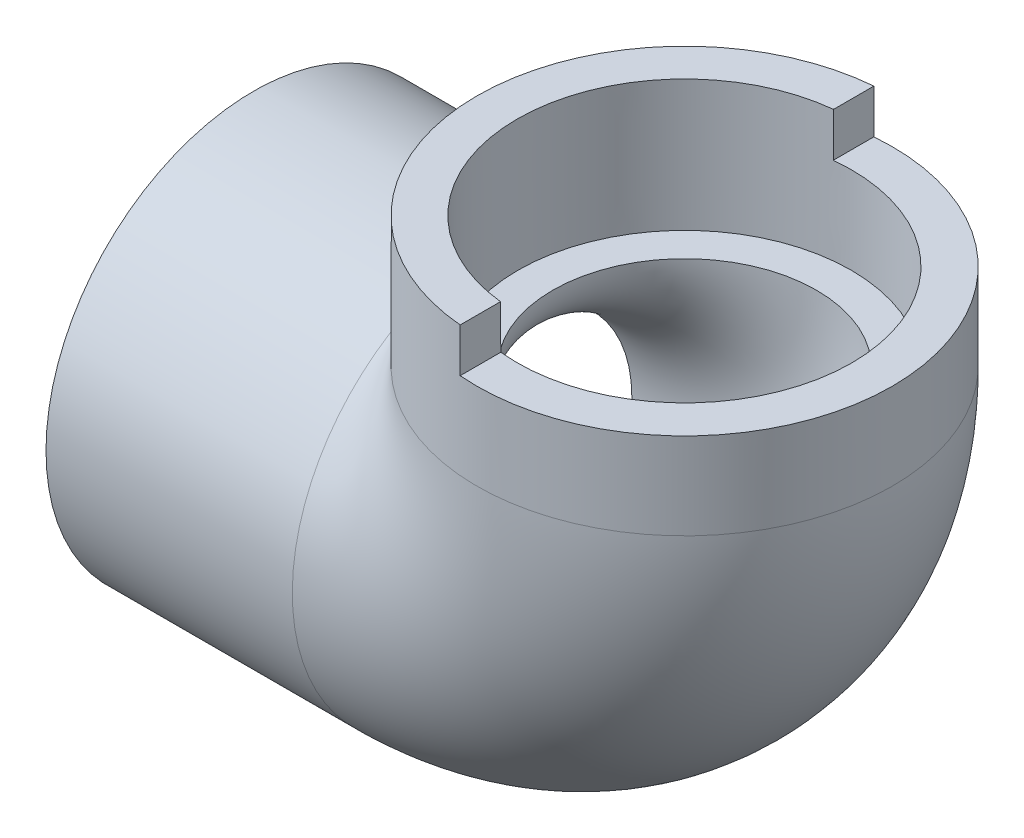
ISO-10303-21;
HEADER;
FILE_DESCRIPTION(('STEP AP214'),'2;1');
FILE_NAME('part.step','',(''),(''),'','','');
FILE_SCHEMA(('AUTOMOTIVE_DESIGN { 1 0 10303 214 1 1 1 1 }'));
ENDSEC;
DATA;
#1=APPLICATION_CONTEXT('core data for automotive mechanical design processes');
#2=APPLICATION_PROTOCOL_DEFINITION('international standard','automotive_design',2000,#1);
#3=PRODUCT_CONTEXT('',#1,'mechanical');
#4=PRODUCT('Part','Part','',(#3));
#5=PRODUCT_RELATED_PRODUCT_CATEGORY('part','',(#4));
#6=PRODUCT_DEFINITION_FORMATION('','',#4);
#7=PRODUCT_DEFINITION_CONTEXT('part definition',#1,'design');
#8=PRODUCT_DEFINITION('design','',#6,#7);
#9=PRODUCT_DEFINITION_SHAPE('','',#8);
#10=(LENGTH_UNIT() NAMED_UNIT(*) SI_UNIT(.MILLI.,.METRE.));
#11=(NAMED_UNIT(*) PLANE_ANGLE_UNIT() SI_UNIT($,.RADIAN.));
#12=(NAMED_UNIT(*) SI_UNIT($,.STERADIAN.) SOLID_ANGLE_UNIT());
#13=UNCERTAINTY_MEASURE_WITH_UNIT(LENGTH_MEASURE(1.E-05),#10,'distance_accuracy_value','');
#14=(GEOMETRIC_REPRESENTATION_CONTEXT(3) GLOBAL_UNCERTAINTY_ASSIGNED_CONTEXT((#13)) GLOBAL_UNIT_ASSIGNED_CONTEXT((#10,
#11,#12)) REPRESENTATION_CONTEXT('',''));
#15=CARTESIAN_POINT('',(0.,0.,0.));
#16=DIRECTION('',(0.,0.,1.));
#17=DIRECTION('',(1.,0.,0.));
#18=AXIS2_PLACEMENT_3D('',#15,#16,#17);
#19=CARTESIAN_POINT('',(0.,0.,0.));
#20=DIRECTION('',(0.,-1.,0.));
#21=DIRECTION('',(0.,0.,-1.));
#22=AXIS2_PLACEMENT_3D('',#19,#20,#21);
#23=CYLINDRICAL_SURFACE('',#22,29.972);
#24=CARTESIAN_POINT('',(0.,45.5168,0.));
#25=DIRECTION('',(0.,-1.,0.));
#26=DIRECTION('',(0.,0.,-1.));
#27=AXIS2_PLACEMENT_3D('',#24,#25,#26);
#28=CIRCLE('',#27,29.972);
#29=CARTESIAN_POINT('',(-2.54,45.5168,-29.8641789440125));
#30=VERTEX_POINT('',#29);
#31=CARTESIAN_POINT('',(-2.54,45.5168,29.8641789440125));
#32=VERTEX_POINT('',#31);
#33=EDGE_CURVE('E56',#30,#32,#28,.F.);
#34=ORIENTED_EDGE('',*,*,#33,.F.);
#35=DIRECTION('',(0.,-1.,0.));
#36=VECTOR('',#35,1.);
#37=CARTESIAN_POINT('',(-2.54,0.,-29.8641789440125));
#38=LINE('',#37,#36);
#39=CARTESIAN_POINT('',(-2.54,39.1668,-29.8641789440125));
#40=VERTEX_POINT('',#39);
#41=EDGE_CURVE('E270',#40,#30,#38,.F.);
#42=ORIENTED_EDGE('',*,*,#41,.F.);
#43=CARTESIAN_POINT('',(0.,39.1668,0.));
#44=DIRECTION('',(0.,1.,0.));
#45=DIRECTION('',(0.,0.,1.));
#46=AXIS2_PLACEMENT_3D('',#43,#44,#45);
#47=CIRCLE('',#46,29.972);
#48=CARTESIAN_POINT('',(-2.54,39.1668,29.8641789440125));
#49=VERTEX_POINT('',#48);
#50=EDGE_CURVE('E267',#40,#49,#47,.F.);
#51=ORIENTED_EDGE('',*,*,#50,.T.);
#52=DIRECTION('',(0.,-1.,0.));
#53=VECTOR('',#52,1.);
#54=CARTESIAN_POINT('',(-2.54,0.,29.8641789440125));
#55=LINE('',#54,#53);
#56=EDGE_CURVE('E273',#32,#49,#55,.T.);
#57=ORIENTED_EDGE('',*,*,#56,.F.);
#58=EDGE_LOOP('',(#34,#42,#51,#57));
#59=FACE_BOUND('',#58,.T.);
#60=CARTESIAN_POINT('',(0.,26.67,0.));
#61=DIRECTION('',(0.,1.,0.));
#62=DIRECTION('',(0.,0.,-1.));
#63=AXIS2_PLACEMENT_3D('',#60,#61,#62);
#64=CIRCLE('',#63,29.972);
#65=CARTESIAN_POINT('',(-26.67,26.67,13.6759600759873));
#66=VERTEX_POINT('',#65);
#67=CARTESIAN_POINT('',(-26.67,26.67,-13.6759600759873));
#68=VERTEX_POINT('',#67);
#69=EDGE_CURVE('E221',#66,#68,#64,.T.);
#70=ORIENTED_EDGE('',*,*,#69,.T.);
#71=CARTESIAN_POINT('',(0.,0.,0.));
#72=DIRECTION('',(-0.707106781186547,-0.707106781186547,0.));
#73=DIRECTION('',(-0.707106781186547,0.707106781186547,0.));
#74=AXIS2_PLACEMENT_3D('',#71,#72,#73);
#75=ELLIPSE('',#74,42.3868088914464,29.972);
#76=EDGE_CURVE('E164',#68,#66,#75,.F.);
#77=ORIENTED_EDGE('',*,*,#76,.T.);
#78=EDGE_LOOP('',(#70,#77));
#79=FACE_BOUND('',#78,.T.);
#80=ADVANCED_FACE('F35',(#59,#79),#23,.T.);
#81=CARTESIAN_POINT('',(-62.23,-29.972,0.));
#82=DIRECTION('',(-1.,0.,0.));
#83=DIRECTION('',(0.,0.,1.));
#84=AXIS2_PLACEMENT_3D('',#81,#82,#83);
#85=PLANE('',#84);
#86=DIRECTION('',(0.,0.,-1.));
#87=VECTOR('',#86,1.);
#88=CARTESIAN_POINT('',(-62.23,15.24,0.));
#89=LINE('',#88,#87);
#90=CARTESIAN_POINT('',(-62.23,15.24,-18.9044267239184));
#91=VERTEX_POINT('',#90);
#92=CARTESIAN_POINT('',(-62.23,15.24,-25.8081999372293));
#93=VERTEX_POINT('',#92);
#94=EDGE_CURVE('E165',#91,#93,#89,.T.);
#95=ORIENTED_EDGE('',*,*,#94,.F.);
#96=CARTESIAN_POINT('',(-62.23,0.,0.));
#97=DIRECTION('',(-1.,0.,0.));
#98=DIRECTION('',(0.,0.,1.));
#99=AXIS2_PLACEMENT_3D('',#96,#97,#98);
#100=CIRCLE('',#99,24.2824);
#101=CARTESIAN_POINT('',(-62.23,-15.24,-18.9044267239184));
#102=VERTEX_POINT('',#101);
#103=EDGE_CURVE('E243',#102,#91,#100,.T.);
#104=ORIENTED_EDGE('',*,*,#103,.F.);
#105=DIRECTION('',(0.,0.,1.));
#106=VECTOR('',#105,1.);
#107=CARTESIAN_POINT('',(-62.23,-15.24,0.));
#108=LINE('',#107,#106);
#109=CARTESIAN_POINT('',(-62.23,-15.24,-25.8081999372292));
#110=VERTEX_POINT('',#109);
#111=EDGE_CURVE('E184',#110,#102,#108,.T.);
#112=ORIENTED_EDGE('',*,*,#111,.F.);
#113=CARTESIAN_POINT('',(-62.23,0.,0.));
#114=DIRECTION('',(-1.,0.,0.));
#115=DIRECTION('',(0.,0.,1.));
#116=AXIS2_PLACEMENT_3D('',#113,#114,#115);
#117=CIRCLE('',#116,29.972);
#118=EDGE_CURVE('E226',#110,#93,#117,.T.);
#119=ORIENTED_EDGE('',*,*,#118,.T.);
#120=EDGE_LOOP('',(#95,#104,#112,#119));
#121=FACE_BOUND('',#120,.T.);
#122=ADVANCED_FACE('F37',(#121),#85,.T.);
#123=CARTESIAN_POINT('',(-26.67,0.,0.));
#124=DIRECTION('',(-1.,0.,0.));
#125=DIRECTION('',(0.,0.,1.));
#126=AXIS2_PLACEMENT_3D('',#123,#124,#125);
#127=CONICAL_SURFACE('',#126,24.0538,0.00642848287391597);
#128=CARTESIAN_POINT('',(-10.0096650006264,15.24,-18.4712408286054));
#129=CARTESIAN_POINT('',(-26.0768601934431,15.24,-18.6051241695547));
#130=CARTESIAN_POINT('',(-42.1440599585607,15.24,-18.7384542201985));
#131=CARTESIAN_POINT('',(-74.2784686325935,15.24,-19.0040077408685));
#132=CARTESIAN_POINT('',(-90.3456775415088,15.24,-19.1362312108948));
#133=CARTESIAN_POINT('',(-106.412891022725,15.24,-19.2679013906157));
#134=B_SPLINE_CURVE_WITH_KNOTS('',3,(#128,#129,#130,#131,#132,#133),.UNSPECIFIED.,.F.,.F.,(4,2,
4),(0.,48.2032588810279,96.4065177596428),.UNSPECIFIED.);
#135=CARTESIAN_POINT('',(-30.1243327685938,15.24,-18.6385751969886));
#136=VERTEX_POINT('',#135);
#137=EDGE_CURVE('E157',#136,#91,#134,.T.);
#138=ORIENTED_EDGE('',*,*,#137,.F.);
#139=CARTESIAN_POINT('',(-30.1243327685938,0.,0.));
#140=DIRECTION('',(1.,0.,0.));
#141=DIRECTION('',(0.,1.,0.));
#142=AXIS2_PLACEMENT_3D('',#139,#140,#141);
#143=CIRCLE('',#142,24.076006424941);
#144=CARTESIAN_POINT('',(-30.1243327685938,-15.24,-18.6385751969886));
#145=VERTEX_POINT('',#144);
#146=EDGE_CURVE('E183',#145,#136,#143,.T.);
#147=ORIENTED_EDGE('',*,*,#146,.F.);
#148=CARTESIAN_POINT('',(-106.412891022725,-15.24,-19.2679013906156));
#149=CARTESIAN_POINT('',(-90.3456775415088,-15.24,-19.1362312108948));
#150=CARTESIAN_POINT('',(-74.2784686325935,-15.24,-19.0040077408685));
#151=CARTESIAN_POINT('',(-42.1440599585607,-15.24,-18.7384542201985));
#152=CARTESIAN_POINT('',(-26.0768601934431,-15.24,-18.6051241695547));
#153=CARTESIAN_POINT('',(-10.0096650006264,-15.24,-18.4712408286054));
#154=B_SPLINE_CURVE_WITH_KNOTS('',3,(#148,#149,#150,#151,#152,#153),.UNSPECIFIED.,.F.,.F.,(4,2,
4),(0.,48.2032588786149,96.4065177596428),.UNSPECIFIED.);
#155=EDGE_CURVE('E177',#102,#145,#154,.T.);
#156=ORIENTED_EDGE('',*,*,#155,.F.);
#157=ORIENTED_EDGE('',*,*,#103,.T.);
#158=EDGE_LOOP('',(#138,#147,#156,#157));
#159=FACE_BOUND('',#158,.T.);
#160=CARTESIAN_POINT('',(-26.67,0.,0.));
#161=DIRECTION('',(-1.,0.,0.));
#162=DIRECTION('',(0.,0.,1.));
#163=AXIS2_PLACEMENT_3D('',#160,#161,#162);
#164=CIRCLE('',#163,24.0538);
#165=CARTESIAN_POINT('',(-26.67,0.,24.0538));
#166=VERTEX_POINT('',#165);
#167=EDGE_CURVE('E230',#166,#166,#164,.T.);
#168=ORIENTED_EDGE('',*,*,#167,.F.);
#169=EDGE_LOOP('',(#168));
#170=FACE_BOUND('',#169,.T.);
#171=ADVANCED_FACE('F168',(#159,#170),#127,.F.);
#172=CARTESIAN_POINT('',(-62.23,0.,0.));
#173=DIRECTION('',(-1.,0.,0.));
#174=DIRECTION('',(0.,0.,1.));
#175=AXIS2_PLACEMENT_3D('',#172,#173,#174);
#176=CYLINDRICAL_SURFACE('',#175,29.972);
#177=DIRECTION('',(-1.,0.,0.));
#178=VECTOR('',#177,1.);
#179=CARTESIAN_POINT('',(-62.23,15.24,-25.8081999372293));
#180=LINE('',#179,#178);
#181=CARTESIAN_POINT('',(-30.1243327685938,15.24,-25.8081999372293));
#182=VERTEX_POINT('',#181);
#183=EDGE_CURVE('E127',#93,#182,#180,.F.);
#184=ORIENTED_EDGE('',*,*,#183,.F.);
#185=ORIENTED_EDGE('',*,*,#118,.F.);
#186=DIRECTION('',(-1.,0.,0.));
#187=VECTOR('',#186,1.);
#188=CARTESIAN_POINT('',(-62.23,-15.24,-25.8081999372292));
#189=LINE('',#188,#187);
#190=CARTESIAN_POINT('',(-30.1243327685938,-15.24,-25.8081999372292));
#191=VERTEX_POINT('',#190);
#192=EDGE_CURVE('E130',#191,#110,#189,.T.);
#193=ORIENTED_EDGE('',*,*,#192,.F.);
#194=CARTESIAN_POINT('',(-30.1243327685938,0.,0.));
#195=DIRECTION('',(1.,0.,0.));
#196=DIRECTION('',(0.,1.,0.));
#197=AXIS2_PLACEMENT_3D('',#194,#195,#196);
#198=CIRCLE('',#197,29.972);
#199=EDGE_CURVE('E249',#182,#191,#198,.F.);
#200=ORIENTED_EDGE('',*,*,#199,.F.);
#201=EDGE_LOOP('',(#184,#185,#193,#200));
#202=FACE_BOUND('',#201,.T.);
#203=ORIENTED_EDGE('',*,*,#76,.F.);
#204=CARTESIAN_POINT('',(-26.67,0.,0.));
#205=DIRECTION('',(-1.,0.,0.));
#206=DIRECTION('',(0.,0.,1.));
#207=AXIS2_PLACEMENT_3D('',#204,#205,#206);
#208=CIRCLE('',#207,29.972);
#209=EDGE_CURVE('E223',#68,#66,#208,.T.);
#210=ORIENTED_EDGE('',*,*,#209,.T.);
#211=EDGE_LOOP('',(#203,#210));
#212=FACE_BOUND('',#211,.T.);
#213=ADVANCED_FACE('F172',(#202,#212),#176,.T.);
#214=CARTESIAN_POINT('',(-26.67,26.67,0.));
#215=DIRECTION('',(0.,0.,-1.));
#216=DIRECTION('',(-1.,0.,0.));
#217=AXIS2_PLACEMENT_3D('',#214,#215,#216);
#218=TOROIDAL_SURFACE('',#217,26.67,19.05);
#219=CARTESIAN_POINT('',(0.,26.67,0.));
#220=DIRECTION('',(0.,1.,0.));
#221=DIRECTION('',(0.,0.,-1.));
#222=AXIS2_PLACEMENT_3D('',#219,#220,#221);
#223=CIRCLE('',#222,19.05);
#224=CARTESIAN_POINT('',(19.05,26.67,0.));
#225=VERTEX_POINT('',#224);
#226=EDGE_CURVE('E227',#225,#225,#223,.T.);
#227=CARTESIAN_POINT('',(-26.67,0.,0.));
#228=DIRECTION('',(1.,0.,0.));
#229=DIRECTION('',(0.,0.,-1.));
#230=AXIS2_PLACEMENT_3D('',#227,#228,#229);
#231=CIRCLE('',#230,19.05);
#232=CARTESIAN_POINT('',(-26.67,-19.05,0.));
#233=VERTEX_POINT('',#232);
#234=EDGE_CURVE('E232',#233,#233,#231,.T.);
#235=CARTESIAN_POINT('',(-26.67,26.67,0.));
#236=DIRECTION('',(0.,0.,-1.));
#237=DIRECTION('',(-1.,0.,0.));
#238=AXIS2_PLACEMENT_3D('',#235,#236,#237);
#239=CIRCLE('',#238,45.72);
#240=EDGE_CURVE('',#225,#233,#239,.T.);
#241=ORIENTED_EDGE('',*,*,#226,.T.);
#242=ORIENTED_EDGE('',*,*,#234,.F.);
#243=ORIENTED_EDGE('',*,*,#240,.T.);
#244=ORIENTED_EDGE('',*,*,#240,.F.);
#245=EDGE_LOOP('',(#241,#243,#242,#244));
#246=FACE_BOUND('',#245,.T.);
#247=ADVANCED_FACE('F213',(#246),#218,.F.);
#248=CARTESIAN_POINT('',(-53.34,26.67,0.));
#249=DIRECTION('',(0.,-1.,0.));
#250=DIRECTION('',(-1.,0.,0.));
#251=AXIS2_PLACEMENT_3D('',#248,#249,#250);
#252=CIRCLE('',#251,29.972);
#253=TRIMMED_CURVE('',#252,(PARAMETER_VALUE(-2.66776990694721)),
(PARAMETER_VALUE(2.66776990694721)),.T.,.PARAMETER.);
#254=CARTESIAN_POINT('',(-26.67,26.67,0.));
#255=DIRECTION('',(0.,0.,-1.));
#256=AXIS1_PLACEMENT('',#254,#255);
#257=SURFACE_OF_REVOLUTION('',#253,#256);
#258=ORIENTED_EDGE('',*,*,#69,.F.);
#259=ORIENTED_EDGE('',*,*,#209,.F.);
#260=EDGE_LOOP('',(#258,#259));
#261=FACE_BOUND('',#260,.T.);
#262=ADVANCED_FACE('F211',(#261),#257,.T.);
#263=CARTESIAN_POINT('',(0.,26.67,0.));
#264=DIRECTION('',(0.,1.,0.));
#265=DIRECTION('',(0.,0.,-1.));
#266=AXIS2_PLACEMENT_3D('',#263,#264,#265);
#267=PLANE('',#266);
#268=CARTESIAN_POINT('',(0.,26.67,0.));
#269=DIRECTION('',(0.,1.,0.));
#270=DIRECTION('',(-1.,0.,0.));
#271=AXIS2_PLACEMENT_3D('',#268,#269,#270);
#272=CIRCLE('',#271,24.0538);
#273=CARTESIAN_POINT('',(-24.0538,26.67,0.));
#274=VERTEX_POINT('',#273);
#275=EDGE_CURVE('E246',#274,#274,#272,.F.);
#276=ORIENTED_EDGE('',*,*,#275,.F.);
#277=EDGE_LOOP('',(#276));
#278=FACE_BOUND('',#277,.T.);
#279=ORIENTED_EDGE('',*,*,#226,.F.);
#280=EDGE_LOOP('',(#279));
#281=FACE_BOUND('',#280,.T.);
#282=ADVANCED_FACE('F207',(#278,#281),#267,.T.);
#283=CARTESIAN_POINT('',(-26.67,0.,0.));
#284=DIRECTION('',(1.,0.,0.));
#285=DIRECTION('',(0.,0.,-1.));
#286=AXIS2_PLACEMENT_3D('',#283,#284,#285);
#287=PLANE('',#286);
#288=ORIENTED_EDGE('',*,*,#167,.T.);
#289=EDGE_LOOP('',(#288));
#290=FACE_BOUND('',#289,.T.);
#291=ORIENTED_EDGE('',*,*,#234,.T.);
#292=EDGE_LOOP('',(#291));
#293=FACE_BOUND('',#292,.T.);
#294=ADVANCED_FACE('F204',(#290,#293),#287,.F.);
#295=CARTESIAN_POINT('',(0.,62.23,0.));
#296=DIRECTION('',(0.,1.,0.));
#297=DIRECTION('',(0.,0.,1.));
#298=AXIS2_PLACEMENT_3D('',#295,#296,#297);
#299=CONICAL_SURFACE('',#298,24.2824,0.00642848287391597);
#300=CARTESIAN_POINT('',(0.,45.5168,0.));
#301=DIRECTION('',(0.,-1.,0.));
#302=DIRECTION('',(0.,0.,-1.));
#303=AXIS2_PLACEMENT_3D('',#300,#301,#302);
#304=CIRCLE('',#303,24.174958);
#305=CARTESIAN_POINT('',(-2.54,45.5168,24.0411521001337));
#306=VERTEX_POINT('',#305);
#307=CARTESIAN_POINT('',(-2.54,45.5168,-24.0411521001337));
#308=VERTEX_POINT('',#307);
#309=EDGE_CURVE('E113',#306,#308,#304,.T.);
#310=ORIENTED_EDGE('',*,*,#309,.F.);
#311=CARTESIAN_POINT('',(-2.54,-5.69493719445968,23.7100759454222));
#312=CARTESIAN_POINT('',(-2.54,10.3047432684216,23.8135193545098));
#313=CARTESIAN_POINT('',(-2.54,26.3044237790618,23.9169553756303));
#314=CARTESIAN_POINT('',(-2.54,58.30378489586,24.1238126419371));
#315=CARTESIAN_POINT('',(-2.54,74.3034655020179,24.2272338871235));
#316=CARTESIAN_POINT('',(-2.54,90.3031461559348,24.3306477443427));
#317=B_SPLINE_CURVE_WITH_KNOTS('',3,(#311,#312,#313,#314,#315,#316),.UNSPECIFIED.,.F.,.F.,(4,2,
4),(0.,48.0000445737004,96.0000891474006),.UNSPECIFIED.);
#318=CARTESIAN_POINT('',(-2.54,39.1668,24.0001030841196));
#319=VERTEX_POINT('',#318);
#320=EDGE_CURVE('E124',#319,#306,#317,.T.);
#321=ORIENTED_EDGE('',*,*,#320,.F.);
#322=CARTESIAN_POINT('',(0.,39.1668,0.));
#323=DIRECTION('',(0.,1.,0.));
#324=DIRECTION('',(0.,0.,1.));
#325=AXIS2_PLACEMENT_3D('',#322,#323,#324);
#326=CIRCLE('',#325,24.1341365714286);
#327=CARTESIAN_POINT('',(-2.54,39.1668,-24.0001030841196));
#328=VERTEX_POINT('',#327);
#329=EDGE_CURVE('E49',#319,#328,#326,.T.);
#330=ORIENTED_EDGE('',*,*,#329,.T.);
#331=CARTESIAN_POINT('',(-2.54,90.3031461559348,-24.3306477443427));
#332=CARTESIAN_POINT('',(-2.54,74.3034655020179,-24.2272338871235));
#333=CARTESIAN_POINT('',(-2.54,58.30378489586,-24.1238126419371));
#334=CARTESIAN_POINT('',(-2.54,26.3044237790618,-23.9169553756303));
#335=CARTESIAN_POINT('',(-2.54,10.3047432684216,-23.8135193545098));
#336=CARTESIAN_POINT('',(-2.54,-5.69493719445968,-23.7100759454222));
#337=B_SPLINE_CURVE_WITH_KNOTS('',3,(#331,#332,#333,#334,#335,#336),.UNSPECIFIED.,.F.,.F.,(4,2,
4),(0.,48.0000445737002,96.0000891474006),.UNSPECIFIED.);
#338=EDGE_CURVE('E11',#308,#328,#337,.T.);
#339=ORIENTED_EDGE('',*,*,#338,.F.);
#340=EDGE_LOOP('',(#310,#321,#330,#339));
#341=FACE_BOUND('',#340,.T.);
#342=ORIENTED_EDGE('',*,*,#275,.T.);
#343=EDGE_LOOP('',(#342));
#344=FACE_BOUND('',#343,.T.);
#345=ADVANCED_FACE('F121',(#341,#344),#299,.F.);
#346=CARTESIAN_POINT('',(-30.1243327685938,15.24,-29.972));
#347=DIRECTION('',(0.,1.,0.));
#348=DIRECTION('',(-1.,0.,0.));
#349=AXIS2_PLACEMENT_3D('',#346,#347,#348);
#350=PLANE('',#349);
#351=ORIENTED_EDGE('',*,*,#137,.T.);
#352=ORIENTED_EDGE('',*,*,#94,.T.);
#353=ORIENTED_EDGE('',*,*,#183,.T.);
#354=DIRECTION('',(0.,0.,1.));
#355=VECTOR('',#354,1.);
#356=CARTESIAN_POINT('',(-30.1243327685938,15.24,-29.972));
#357=LINE('',#356,#355);
#358=EDGE_CURVE('E260',#182,#136,#357,.T.);
#359=ORIENTED_EDGE('',*,*,#358,.T.);
#360=EDGE_LOOP('',(#351,#352,#353,#359));
#361=FACE_BOUND('',#360,.T.);
#362=ADVANCED_FACE('F150',(#361),#350,.F.);
#363=CARTESIAN_POINT('',(-30.1243327685938,15.24,-29.972));
#364=DIRECTION('',(1.,0.,0.));
#365=DIRECTION('',(0.,1.,0.));
#366=AXIS2_PLACEMENT_3D('',#363,#364,#365);
#367=PLANE('',#366);
#368=ORIENTED_EDGE('',*,*,#146,.T.);
#369=ORIENTED_EDGE('',*,*,#358,.F.);
#370=ORIENTED_EDGE('',*,*,#199,.T.);
#371=DIRECTION('',(0.,0.,1.));
#372=VECTOR('',#371,1.);
#373=CARTESIAN_POINT('',(-30.1243327685938,-15.24,-29.972));
#374=LINE('',#373,#372);
#375=EDGE_CURVE('E255',#191,#145,#374,.T.);
#376=ORIENTED_EDGE('',*,*,#375,.T.);
#377=EDGE_LOOP('',(#368,#369,#370,#376));
#378=FACE_BOUND('',#377,.T.);
#379=ADVANCED_FACE('F154',(#378),#367,.F.);
#380=CARTESIAN_POINT('',(-30.1243327685938,-15.24,-29.972));
#381=DIRECTION('',(0.,-1.,0.));
#382=DIRECTION('',(1.,0.,0.));
#383=AXIS2_PLACEMENT_3D('',#380,#381,#382);
#384=PLANE('',#383);
#385=ORIENTED_EDGE('',*,*,#155,.T.);
#386=ORIENTED_EDGE('',*,*,#375,.F.);
#387=ORIENTED_EDGE('',*,*,#192,.T.);
#388=ORIENTED_EDGE('',*,*,#111,.T.);
#389=EDGE_LOOP('',(#385,#386,#387,#388));
#390=FACE_BOUND('',#389,.T.);
#391=ADVANCED_FACE('F186',(#390),#384,.F.);
#392=CARTESIAN_POINT('',(-2.54,0.,0.));
#393=DIRECTION('',(-1.,0.,0.));
#394=DIRECTION('',(0.,0.,1.));
#395=AXIS2_PLACEMENT_3D('',#392,#393,#394);
#396=PLANE('',#395);
#397=ORIENTED_EDGE('',*,*,#41,.T.);
#398=DIRECTION('',(0.,0.,1.));
#399=VECTOR('',#398,1.);
#400=CARTESIAN_POINT('',(-2.54,45.5168,31.75));
#401=LINE('',#400,#399);
#402=EDGE_CURVE('E116',#30,#308,#401,.T.);
#403=ORIENTED_EDGE('',*,*,#402,.T.);
#404=ORIENTED_EDGE('',*,*,#338,.T.);
#405=DIRECTION('',(0.,0.,-1.));
#406=VECTOR('',#405,1.);
#407=CARTESIAN_POINT('',(-2.54,39.1668,31.75));
#408=LINE('',#407,#406);
#409=EDGE_CURVE('E275',#328,#40,#408,.T.);
#410=ORIENTED_EDGE('',*,*,#409,.T.);
#411=EDGE_LOOP('',(#397,#403,#404,#410));
#412=FACE_BOUND('',#411,.T.);
#413=ADVANCED_FACE('F145',(#412),#396,.F.);
#414=CARTESIAN_POINT('',(29.972,39.1668,31.75));
#415=DIRECTION('',(0.,1.,0.));
#416=DIRECTION('',(0.,0.,1.));
#417=AXIS2_PLACEMENT_3D('',#414,#415,#416);
#418=PLANE('',#417);
#419=ORIENTED_EDGE('',*,*,#409,.F.);
#420=ORIENTED_EDGE('',*,*,#329,.F.);
#421=EDGE_CURVE('E64',#49,#319,#408,.T.);
#422=ORIENTED_EDGE('',*,*,#421,.F.);
#423=ORIENTED_EDGE('',*,*,#50,.F.);
#424=EDGE_LOOP('',(#419,#420,#422,#423));
#425=FACE_BOUND('',#424,.T.);
#426=ADVANCED_FACE('F144',(#425),#418,.T.);
#427=ORIENTED_EDGE('',*,*,#56,.T.);
#428=ORIENTED_EDGE('',*,*,#421,.T.);
#429=ORIENTED_EDGE('',*,*,#320,.T.);
#430=EDGE_CURVE('E110',#306,#32,#401,.T.);
#431=ORIENTED_EDGE('',*,*,#430,.T.);
#432=EDGE_LOOP('',(#427,#428,#429,#431));
#433=FACE_BOUND('',#432,.T.);
#434=ADVANCED_FACE('F126',(#433),#396,.F.);
#435=CARTESIAN_POINT('',(0.,45.5168,0.));
#436=DIRECTION('',(0.,-1.,0.));
#437=DIRECTION('',(0.,0.,-1.));
#438=AXIS2_PLACEMENT_3D('',#435,#436,#437);
#439=PLANE('',#438);
#440=ORIENTED_EDGE('',*,*,#33,.T.);
#441=ORIENTED_EDGE('',*,*,#430,.F.);
#442=ORIENTED_EDGE('',*,*,#309,.T.);
#443=ORIENTED_EDGE('',*,*,#402,.F.);
#444=EDGE_LOOP('',(#440,#441,#442,#443));
#445=FACE_BOUND('',#444,.T.);
#446=ADVANCED_FACE('F112',(#445),#439,.F.);
#447=CLOSED_SHELL('',(#80,#122,#171,#213,#247,#262,#282,#294,#345,#362,#379,#391,#413,#426,#434,#446));
#448=MANIFOLD_SOLID_BREP('B2',#447);
#449=ADVANCED_BREP_SHAPE_REPRESENTATION('',(#18,#448),#14);
#450=SHAPE_DEFINITION_REPRESENTATION(#9,#449);
ENDSEC;
END-ISO-10303-21;
